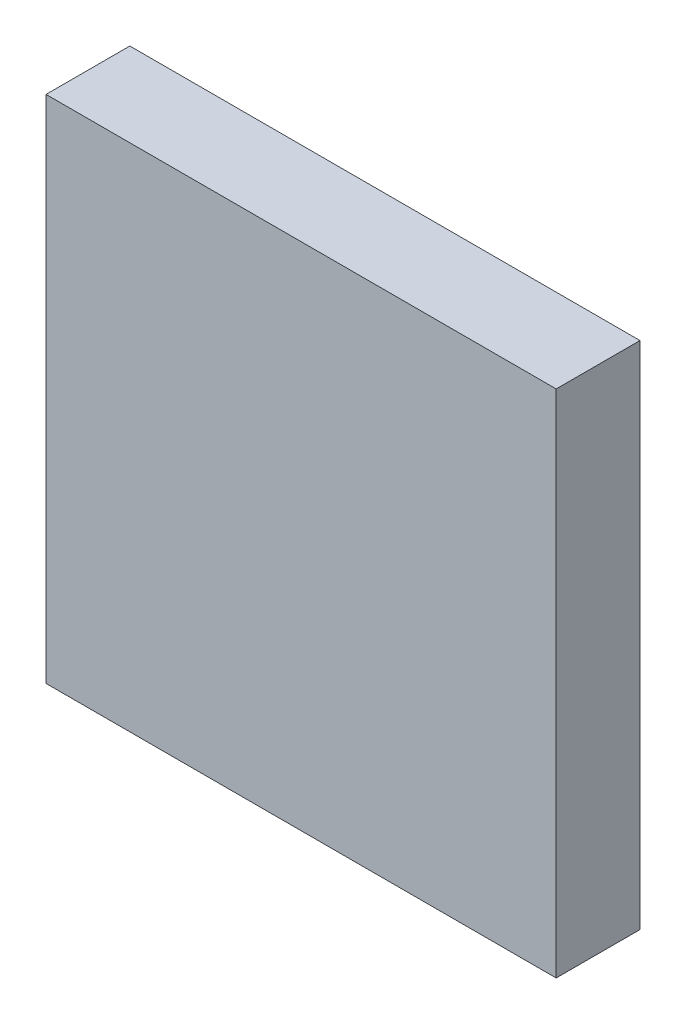
ISO-10303-21;
HEADER;
FILE_DESCRIPTION(('STEP AP214'),'2;1');
FILE_NAME('part.step','',(''),(''),'','','');
FILE_SCHEMA(('AUTOMOTIVE_DESIGN { 1 0 10303 214 1 1 1 1 }'));
ENDSEC;
DATA;
#1=APPLICATION_CONTEXT('core data for automotive mechanical design processes');
#2=APPLICATION_PROTOCOL_DEFINITION('international standard','automotive_design',2000,#1);
#3=PRODUCT_CONTEXT('',#1,'mechanical');
#4=PRODUCT('Part','Part','',(#3));
#5=PRODUCT_RELATED_PRODUCT_CATEGORY('part','',(#4));
#6=PRODUCT_DEFINITION_FORMATION('','',#4);
#7=PRODUCT_DEFINITION_CONTEXT('part definition',#1,'design');
#8=PRODUCT_DEFINITION('design','',#6,#7);
#9=PRODUCT_DEFINITION_SHAPE('','',#8);
#10=(LENGTH_UNIT() NAMED_UNIT(*) SI_UNIT(.MILLI.,.METRE.));
#11=(NAMED_UNIT(*) PLANE_ANGLE_UNIT() SI_UNIT($,.RADIAN.));
#12=(NAMED_UNIT(*) SI_UNIT($,.STERADIAN.) SOLID_ANGLE_UNIT());
#13=UNCERTAINTY_MEASURE_WITH_UNIT(LENGTH_MEASURE(1.E-05),#10,'distance_accuracy_value','');
#14=(GEOMETRIC_REPRESENTATION_CONTEXT(3) GLOBAL_UNCERTAINTY_ASSIGNED_CONTEXT((#13)) GLOBAL_UNIT_ASSIGNED_CONTEXT((#10,
#11,#12)) REPRESENTATION_CONTEXT('',''));
#15=CARTESIAN_POINT('',(0.,0.,0.));
#16=DIRECTION('',(0.,0.,1.));
#17=DIRECTION('',(1.,0.,0.));
#18=AXIS2_PLACEMENT_3D('',#15,#16,#17);
#19=CARTESIAN_POINT('',(-3.50000062,-3.50000062,0.));
#20=DIRECTION('',(0.,0.,-1.));
#21=DIRECTION('',(-1.,0.,0.));
#22=AXIS2_PLACEMENT_3D('',#19,#20,#21);
#23=PLANE('',#22);
#24=DIRECTION('',(0.,1.,0.));
#25=VECTOR('',#24,1.);
#26=CARTESIAN_POINT('',(3.50000062,-3.50000062,0.));
#27=LINE('',#26,#25);
#28=CARTESIAN_POINT('',(3.50000062,3.50000062,0.));
#29=VERTEX_POINT('',#28);
#30=CARTESIAN_POINT('',(3.50000062,-3.50000062,0.));
#31=VERTEX_POINT('',#30);
#32=EDGE_CURVE('E59',#29,#31,#27,.F.);
#33=ORIENTED_EDGE('',*,*,#32,.T.);
#34=DIRECTION('',(1.,0.,0.));
#35=VECTOR('',#34,1.);
#36=CARTESIAN_POINT('',(-3.50000062,-3.50000062,0.));
#37=LINE('',#36,#35);
#38=CARTESIAN_POINT('',(-3.50000062,-3.50000062,0.));
#39=VERTEX_POINT('',#38);
#40=EDGE_CURVE('E21',#31,#39,#37,.F.);
#41=ORIENTED_EDGE('',*,*,#40,.T.);
#42=DIRECTION('',(0.,1.,0.));
#43=VECTOR('',#42,1.);
#44=CARTESIAN_POINT('',(-3.50000062,3.50000062,0.));
#45=LINE('',#44,#43);
#46=CARTESIAN_POINT('',(-3.50000062,3.50000062,0.));
#47=VERTEX_POINT('',#46);
#48=EDGE_CURVE('E56',#39,#47,#45,.T.);
#49=ORIENTED_EDGE('',*,*,#48,.T.);
#50=DIRECTION('',(1.,0.,0.));
#51=VECTOR('',#50,1.);
#52=CARTESIAN_POINT('',(3.50000062,3.50000062,0.));
#53=LINE('',#52,#51);
#54=EDGE_CURVE('E77',#47,#29,#53,.T.);
#55=ORIENTED_EDGE('',*,*,#54,.T.);
#56=EDGE_LOOP('',(#33,#41,#49,#55));
#57=FACE_BOUND('',#56,.T.);
#58=ADVANCED_FACE('F18',(#57),#23,.T.);
#59=CARTESIAN_POINT('',(-3.50000062,-3.50000062,0.));
#60=DIRECTION('',(0.,1.,0.));
#61=DIRECTION('',(0.,0.,1.));
#62=AXIS2_PLACEMENT_3D('',#59,#60,#61);
#63=PLANE('',#62);
#64=DIRECTION('',(0.,0.,1.));
#65=VECTOR('',#64,1.);
#66=CARTESIAN_POINT('',(3.50000062,-3.50000062,0.));
#67=LINE('',#66,#65);
#68=CARTESIAN_POINT('',(3.50000062,-3.50000062,1.15000024));
#69=VERTEX_POINT('',#68);
#70=EDGE_CURVE('E79',#31,#69,#67,.T.);
#71=ORIENTED_EDGE('',*,*,#70,.T.);
#72=DIRECTION('',(-1.,0.,0.));
#73=VECTOR('',#72,1.);
#74=CARTESIAN_POINT('',(-3.50000062,-3.50000062,1.15000024));
#75=LINE('',#74,#73);
#76=CARTESIAN_POINT('',(-3.50000062,-3.50000062,1.15000024));
#77=VERTEX_POINT('',#76);
#78=EDGE_CURVE('E74',#69,#77,#75,.T.);
#79=ORIENTED_EDGE('',*,*,#78,.T.);
#80=DIRECTION('',(0.,0.,-1.));
#81=VECTOR('',#80,1.);
#82=CARTESIAN_POINT('',(-3.50000062,-3.50000062,0.));
#83=LINE('',#82,#81);
#84=EDGE_CURVE('E64',#77,#39,#83,.T.);
#85=ORIENTED_EDGE('',*,*,#84,.T.);
#86=ORIENTED_EDGE('',*,*,#40,.F.);
#87=EDGE_LOOP('',(#71,#79,#85,#86));
#88=FACE_BOUND('',#87,.T.);
#89=ADVANCED_FACE('F73',(#88),#63,.F.);
#90=CARTESIAN_POINT('',(-3.50000062,3.50000062,0.));
#91=DIRECTION('',(1.,0.,0.));
#92=DIRECTION('',(0.,0.,-1.));
#93=AXIS2_PLACEMENT_3D('',#90,#91,#92);
#94=PLANE('',#93);
#95=ORIENTED_EDGE('',*,*,#84,.F.);
#96=DIRECTION('',(0.,1.,0.));
#97=VECTOR('',#96,1.);
#98=CARTESIAN_POINT('',(-3.50000062,-3.50000062,1.15000024));
#99=LINE('',#98,#97);
#100=CARTESIAN_POINT('',(-3.50000062,3.50000062,1.15000024));
#101=VERTEX_POINT('',#100);
#102=EDGE_CURVE('E84',#77,#101,#99,.T.);
#103=ORIENTED_EDGE('',*,*,#102,.T.);
#104=DIRECTION('',(0.,0.,-1.));
#105=VECTOR('',#104,1.);
#106=CARTESIAN_POINT('',(-3.50000062,3.50000062,0.));
#107=LINE('',#106,#105);
#108=EDGE_CURVE('E70',#101,#47,#107,.T.);
#109=ORIENTED_EDGE('',*,*,#108,.T.);
#110=ORIENTED_EDGE('',*,*,#48,.F.);
#111=EDGE_LOOP('',(#95,#103,#109,#110));
#112=FACE_BOUND('',#111,.T.);
#113=ADVANCED_FACE('F67',(#112),#94,.F.);
#114=CARTESIAN_POINT('',(3.50000062,3.50000062,0.));
#115=DIRECTION('',(0.,-1.,0.));
#116=DIRECTION('',(0.,0.,-1.));
#117=AXIS2_PLACEMENT_3D('',#114,#115,#116);
#118=PLANE('',#117);
#119=ORIENTED_EDGE('',*,*,#108,.F.);
#120=DIRECTION('',(-1.,0.,0.));
#121=VECTOR('',#120,1.);
#122=CARTESIAN_POINT('',(-3.50000062,3.50000062,1.15000024));
#123=LINE('',#122,#121);
#124=CARTESIAN_POINT('',(3.50000062,3.50000062,1.15000024));
#125=VERTEX_POINT('',#124);
#126=EDGE_CURVE('E27',#101,#125,#123,.F.);
#127=ORIENTED_EDGE('',*,*,#126,.T.);
#128=DIRECTION('',(0.,0.,1.));
#129=VECTOR('',#128,1.);
#130=CARTESIAN_POINT('',(3.50000062,3.50000062,0.));
#131=LINE('',#130,#129);
#132=EDGE_CURVE('E35',#125,#29,#131,.F.);
#133=ORIENTED_EDGE('',*,*,#132,.T.);
#134=ORIENTED_EDGE('',*,*,#54,.F.);
#135=EDGE_LOOP('',(#119,#127,#133,#134));
#136=FACE_BOUND('',#135,.T.);
#137=ADVANCED_FACE('F89',(#136),#118,.F.);
#138=CARTESIAN_POINT('',(3.50000062,-3.50000062,0.));
#139=DIRECTION('',(-1.,0.,0.));
#140=DIRECTION('',(0.,0.,1.));
#141=AXIS2_PLACEMENT_3D('',#138,#139,#140);
#142=PLANE('',#141);
#143=ORIENTED_EDGE('',*,*,#132,.F.);
#144=DIRECTION('',(0.,1.,0.));
#145=VECTOR('',#144,1.);
#146=CARTESIAN_POINT('',(3.50000062,-3.50000062,1.15000024));
#147=LINE('',#146,#145);
#148=EDGE_CURVE('E11',#125,#69,#147,.F.);
#149=ORIENTED_EDGE('',*,*,#148,.T.);
#150=ORIENTED_EDGE('',*,*,#70,.F.);
#151=ORIENTED_EDGE('',*,*,#32,.F.);
#152=EDGE_LOOP('',(#143,#149,#150,#151));
#153=FACE_BOUND('',#152,.T.);
#154=ADVANCED_FACE('F92',(#153),#142,.F.);
#155=CARTESIAN_POINT('',(-3.50000062,-3.50000062,1.15000024));
#156=DIRECTION('',(0.,0.,-1.));
#157=DIRECTION('',(-1.,0.,0.));
#158=AXIS2_PLACEMENT_3D('',#155,#156,#157);
#159=PLANE('',#158);
#160=ORIENTED_EDGE('',*,*,#126,.F.);
#161=ORIENTED_EDGE('',*,*,#102,.F.);
#162=ORIENTED_EDGE('',*,*,#78,.F.);
#163=ORIENTED_EDGE('',*,*,#148,.F.);
#164=EDGE_LOOP('',(#160,#161,#162,#163));
#165=FACE_BOUND('',#164,.T.);
#166=ADVANCED_FACE('F91',(#165),#159,.F.);
#167=CLOSED_SHELL('',(#58,#89,#113,#137,#154,#166));
#168=MANIFOLD_SOLID_BREP('B1',#167);
#169=ADVANCED_BREP_SHAPE_REPRESENTATION('',(#18,#168),#14);
#170=SHAPE_DEFINITION_REPRESENTATION(#9,#169);
ENDSEC;
END-ISO-10303-21;
